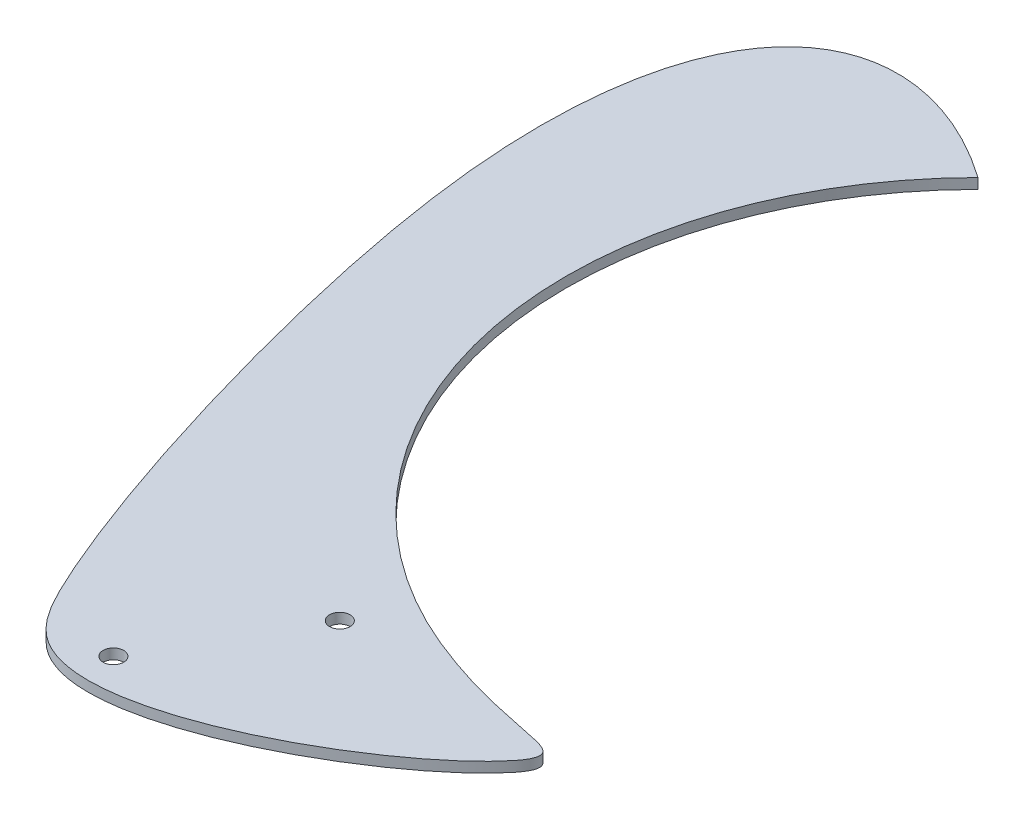
ISO-10303-21;
HEADER;
FILE_DESCRIPTION(('STEP AP214'),'2;1');
FILE_NAME('part.step','',(''),(''),'','','');
FILE_SCHEMA(('AUTOMOTIVE_DESIGN { 1 0 10303 214 1 1 1 1 }'));
ENDSEC;
DATA;
#1=APPLICATION_CONTEXT('core data for automotive mechanical design processes');
#2=APPLICATION_PROTOCOL_DEFINITION('international standard','automotive_design',2000,#1);
#3=PRODUCT_CONTEXT('',#1,'mechanical');
#4=PRODUCT('Part','Part','',(#3));
#5=PRODUCT_RELATED_PRODUCT_CATEGORY('part','',(#4));
#6=PRODUCT_DEFINITION_FORMATION('','',#4);
#7=PRODUCT_DEFINITION_CONTEXT('part definition',#1,'design');
#8=PRODUCT_DEFINITION('design','',#6,#7);
#9=PRODUCT_DEFINITION_SHAPE('','',#8);
#10=(LENGTH_UNIT() NAMED_UNIT(*) SI_UNIT(.MILLI.,.METRE.));
#11=(NAMED_UNIT(*) PLANE_ANGLE_UNIT() SI_UNIT($,.RADIAN.));
#12=(NAMED_UNIT(*) SI_UNIT($,.STERADIAN.) SOLID_ANGLE_UNIT());
#13=UNCERTAINTY_MEASURE_WITH_UNIT(LENGTH_MEASURE(1.E-05),#10,'distance_accuracy_value','');
#14=(GEOMETRIC_REPRESENTATION_CONTEXT(3) GLOBAL_UNCERTAINTY_ASSIGNED_CONTEXT((#13)) GLOBAL_UNIT_ASSIGNED_CONTEXT((#10,
#11,#12)) REPRESENTATION_CONTEXT('',''));
#15=CARTESIAN_POINT('',(0.,0.,0.));
#16=DIRECTION('',(0.,0.,1.));
#17=DIRECTION('',(1.,0.,0.));
#18=AXIS2_PLACEMENT_3D('',#15,#16,#17);
#19=CARTESIAN_POINT('',(-311.173001969077,6.35,123.617347375994));
#20=DIRECTION('',(0.,-1.,0.));
#21=DIRECTION('',(0.,0.,-1.));
#22=AXIS2_PLACEMENT_3D('',#19,#20,#21);
#23=PLANE('',#22);
#24=CARTESIAN_POINT('',(-179.605122421383,6.35,-179.605122421383));
#25=CARTESIAN_POINT('',(-280.573661094064,6.35,-250.548217172691));
#26=CARTESIAN_POINT('',(-407.979972417289,6.35,-177.89072552455));
#27=CARTESIAN_POINT('',(-268.823888220688,6.35,278.270507313439));
#28=CARTESIAN_POINT('',(-199.545548532655,6.35,402.867709679596));
#29=CARTESIAN_POINT('',(-35.2574400843787,6.35,312.81324433965));
#30=CARTESIAN_POINT('',(4.03226464103025,6.35,253.353262904319));
#31=CARTESIAN_POINT('',(-44.0747380014744,6.35,256.519593288716));
#32=CARTESIAN_POINT('',(-97.2015918207329,6.35,234.665401257867));
#33=B_SPLINE_CURVE_WITH_KNOTS('',3,(#24,#25,#26,#27,#28,#29,#30,#31,#32),.UNSPECIFIED.,.F.,.F.,
(4,1,1,1,1,1,4),(0.,0.421502513681161,0.634964602611233,0.685831791186029,0.90302522073544,
0.937156959486205,1.),.UNSPECIFIED.);
#34=CARTESIAN_POINT('',(-179.605122421383,6.35,-179.605122421383));
#35=VERTEX_POINT('',#34);
#36=CARTESIAN_POINT('',(-97.2015918207323,6.35,234.665401257867));
#37=VERTEX_POINT('',#36);
#38=EDGE_CURVE('E65',#35,#37,#33,.T.);
#39=ORIENTED_EDGE('',*,*,#38,.T.);
#40=CARTESIAN_POINT('',(0.,6.35,0.));
#41=DIRECTION('',(0.,-1.,0.));
#42=DIRECTION('',(0.,0.,1.));
#43=AXIS2_PLACEMENT_3D('',#40,#41,#42);
#44=CIRCLE('',#43,254.);
#45=EDGE_CURVE('E50',#37,#35,#44,.T.);
#46=ORIENTED_EDGE('',*,*,#45,.T.);
#47=EDGE_LOOP('',(#39,#46));
#48=FACE_BOUND('',#47,.T.);
#49=CARTESIAN_POINT('',(-190.5,6.35,342.958488289951));
#50=DIRECTION('',(0.,1.,0.));
#51=DIRECTION('',(0.,0.,1.));
#52=AXIS2_PLACEMENT_3D('',#49,#50,#51);
#53=CIRCLE('',#52,6.34999999999999);
#54=CARTESIAN_POINT('',(-190.5,6.35,349.308488289951));
#55=VERTEX_POINT('',#54);
#56=EDGE_CURVE('E71',#55,#55,#53,.T.);
#57=ORIENTED_EDGE('',*,*,#56,.F.);
#58=EDGE_LOOP('',(#57));
#59=FACE_BOUND('',#58,.T.);
#60=CARTESIAN_POINT('',(-139.7,6.35,254.058488289951));
#61=DIRECTION('',(0.,1.,0.));
#62=DIRECTION('',(0.,0.,1.));
#63=AXIS2_PLACEMENT_3D('',#60,#61,#62);
#64=CIRCLE('',#63,6.34999999999999);
#65=CARTESIAN_POINT('',(-139.7,6.35,260.408488289951));
#66=VERTEX_POINT('',#65);
#67=EDGE_CURVE('E90',#66,#66,#64,.T.);
#68=ORIENTED_EDGE('',*,*,#67,.F.);
#69=EDGE_LOOP('',(#68));
#70=FACE_BOUND('',#69,.T.);
#71=ADVANCED_FACE('F33',(#48,#59,#70),#23,.F.);
#72=CARTESIAN_POINT('',(-311.173001969077,0.,123.617347375994));
#73=DIRECTION('',(0.,-1.,0.));
#74=DIRECTION('',(0.,0.,-1.));
#75=AXIS2_PLACEMENT_3D('',#72,#73,#74);
#76=PLANE('',#75);
#77=CARTESIAN_POINT('',(-190.5,0.,342.958488289951));
#78=DIRECTION('',(0.,1.,0.));
#79=DIRECTION('',(0.,0.,1.));
#80=AXIS2_PLACEMENT_3D('',#77,#78,#79);
#81=CIRCLE('',#80,6.34999999999999);
#82=CARTESIAN_POINT('',(-190.5,0.,349.308488289951));
#83=VERTEX_POINT('',#82);
#84=EDGE_CURVE('E74',#83,#83,#81,.T.);
#85=ORIENTED_EDGE('',*,*,#84,.T.);
#86=EDGE_LOOP('',(#85));
#87=FACE_BOUND('',#86,.T.);
#88=CARTESIAN_POINT('',(-179.605122421383,0.,-179.605122421383));
#89=CARTESIAN_POINT('',(-280.573661094064,0.,-250.548217172691));
#90=CARTESIAN_POINT('',(-407.979972417289,0.,-177.89072552455));
#91=CARTESIAN_POINT('',(-268.823888220688,0.,278.270507313439));
#92=CARTESIAN_POINT('',(-199.545548532655,0.,402.867709679596));
#93=CARTESIAN_POINT('',(-35.2574400843787,0.,312.81324433965));
#94=CARTESIAN_POINT('',(4.03226464103025,0.,253.353262904319));
#95=CARTESIAN_POINT('',(-44.0747380014744,0.,256.519593288716));
#96=CARTESIAN_POINT('',(-97.2015918207329,0.,234.665401257867));
#97=B_SPLINE_CURVE_WITH_KNOTS('',3,(#88,#89,#90,#91,#92,#93,#94,#95,#96),.UNSPECIFIED.,.F.,.F.,
(4,1,1,1,1,1,4),(0.,0.421502513681161,0.634964602611233,0.685831791186029,0.90302522073544,
0.937156959486205,1.),.UNSPECIFIED.);
#98=CARTESIAN_POINT('',(-179.605122421383,0.,-179.605122421383));
#99=VERTEX_POINT('',#98);
#100=CARTESIAN_POINT('',(-97.2015918207323,0.,234.665401257867));
#101=VERTEX_POINT('',#100);
#102=EDGE_CURVE('E66',#99,#101,#97,.T.);
#103=ORIENTED_EDGE('',*,*,#102,.F.);
#104=CARTESIAN_POINT('',(0.,0.,0.));
#105=DIRECTION('',(0.,-1.,0.));
#106=DIRECTION('',(0.,0.,1.));
#107=AXIS2_PLACEMENT_3D('',#104,#105,#106);
#108=CIRCLE('',#107,254.);
#109=EDGE_CURVE('E58',#101,#99,#108,.T.);
#110=ORIENTED_EDGE('',*,*,#109,.F.);
#111=EDGE_LOOP('',(#103,#110));
#112=FACE_BOUND('',#111,.T.);
#113=CARTESIAN_POINT('',(-139.7,0.,254.058488289951));
#114=DIRECTION('',(0.,1.,0.));
#115=DIRECTION('',(0.,0.,1.));
#116=AXIS2_PLACEMENT_3D('',#113,#114,#115);
#117=CIRCLE('',#116,6.34999999999999);
#118=CARTESIAN_POINT('',(-139.7,0.,260.408488289951));
#119=VERTEX_POINT('',#118);
#120=EDGE_CURVE('E92',#119,#119,#117,.T.);
#121=ORIENTED_EDGE('',*,*,#120,.T.);
#122=EDGE_LOOP('',(#121));
#123=FACE_BOUND('',#122,.T.);
#124=ADVANCED_FACE('F69',(#87,#112,#123),#76,.T.);
#125=DIRECTION('',(0.,-1.,0.));
#126=VECTOR('',#125,1.);
#127=SURFACE_OF_LINEAR_EXTRUSION('',#33,#126);
#128=ORIENTED_EDGE('',*,*,#102,.T.);
#129=DIRECTION('',(0.,-1.,0.));
#130=VECTOR('',#129,1.);
#131=CARTESIAN_POINT('',(-97.2015918207323,6.35,234.665401257867));
#132=LINE('',#131,#130);
#133=EDGE_CURVE('E11',#37,#101,#132,.T.);
#134=ORIENTED_EDGE('',*,*,#133,.F.);
#135=ORIENTED_EDGE('',*,*,#38,.F.);
#136=DIRECTION('',(0.,-1.,0.));
#137=VECTOR('',#136,1.);
#138=CARTESIAN_POINT('',(-179.605122421383,6.35,-179.605122421383));
#139=LINE('',#138,#137);
#140=EDGE_CURVE('E43',#35,#99,#139,.T.);
#141=ORIENTED_EDGE('',*,*,#140,.T.);
#142=EDGE_LOOP('',(#128,#134,#135,#141));
#143=FACE_BOUND('',#142,.T.);
#144=ADVANCED_FACE('F35',(#143),#127,.F.);
#145=CARTESIAN_POINT('',(0.,6.35,0.));
#146=DIRECTION('',(0.,-1.,0.));
#147=DIRECTION('',(0.,0.,-1.));
#148=AXIS2_PLACEMENT_3D('',#145,#146,#147);
#149=CYLINDRICAL_SURFACE('',#148,254.);
#150=ORIENTED_EDGE('',*,*,#109,.T.);
#151=ORIENTED_EDGE('',*,*,#140,.F.);
#152=ORIENTED_EDGE('',*,*,#45,.F.);
#153=ORIENTED_EDGE('',*,*,#133,.T.);
#154=EDGE_LOOP('',(#150,#151,#152,#153));
#155=FACE_BOUND('',#154,.T.);
#156=ADVANCED_FACE('F61',(#155),#149,.F.);
#157=CARTESIAN_POINT('',(-190.5,6.35,342.958488289951));
#158=DIRECTION('',(0.,-1.,0.));
#159=DIRECTION('',(0.,0.,-1.));
#160=AXIS2_PLACEMENT_3D('',#157,#158,#159);
#161=CYLINDRICAL_SURFACE('',#160,6.34999999999999);
#162=ORIENTED_EDGE('',*,*,#56,.T.);
#163=EDGE_LOOP('',(#162));
#164=FACE_BOUND('',#163,.T.);
#165=ORIENTED_EDGE('',*,*,#84,.F.);
#166=EDGE_LOOP('',(#165));
#167=FACE_BOUND('',#166,.T.);
#168=ADVANCED_FACE('F110',(#164,#167),#161,.F.);
#169=CARTESIAN_POINT('',(-139.7,6.35,254.058488289951));
#170=DIRECTION('',(0.,-1.,0.));
#171=DIRECTION('',(0.,0.,-1.));
#172=AXIS2_PLACEMENT_3D('',#169,#170,#171);
#173=CYLINDRICAL_SURFACE('',#172,6.34999999999999);
#174=ORIENTED_EDGE('',*,*,#67,.T.);
#175=EDGE_LOOP('',(#174));
#176=FACE_BOUND('',#175,.T.);
#177=ORIENTED_EDGE('',*,*,#120,.F.);
#178=EDGE_LOOP('',(#177));
#179=FACE_BOUND('',#178,.T.);
#180=ADVANCED_FACE('F98',(#176,#179),#173,.F.);
#181=CLOSED_SHELL('',(#71,#124,#144,#156,#168,#180));
#182=MANIFOLD_SOLID_BREP('B2',#181);
#183=ADVANCED_BREP_SHAPE_REPRESENTATION('',(#18,#182),#14);
#184=SHAPE_DEFINITION_REPRESENTATION(#9,#183);
ENDSEC;
END-ISO-10303-21;
